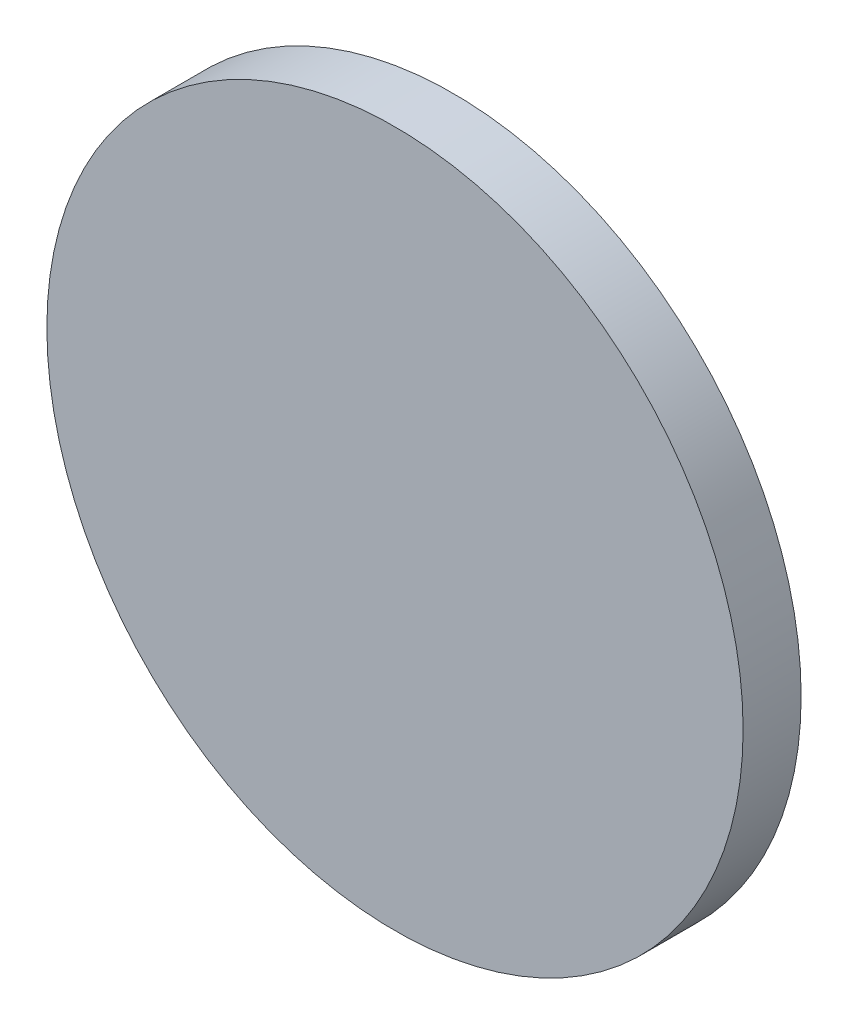
ISO-10303-21;
HEADER;
FILE_DESCRIPTION(('STEP AP214'),'2;1');
FILE_NAME('part.step','',(''),(''),'','','');
FILE_SCHEMA(('AUTOMOTIVE_DESIGN { 1 0 10303 214 1 1 1 1 }'));
ENDSEC;
DATA;
#1=APPLICATION_CONTEXT('core data for automotive mechanical design processes');
#2=APPLICATION_PROTOCOL_DEFINITION('international standard','automotive_design',2000,#1);
#3=PRODUCT_CONTEXT('',#1,'mechanical');
#4=PRODUCT('Part','Part','',(#3));
#5=PRODUCT_RELATED_PRODUCT_CATEGORY('part','',(#4));
#6=PRODUCT_DEFINITION_FORMATION('','',#4);
#7=PRODUCT_DEFINITION_CONTEXT('part definition',#1,'design');
#8=PRODUCT_DEFINITION('design','',#6,#7);
#9=PRODUCT_DEFINITION_SHAPE('','',#8);
#10=(LENGTH_UNIT() NAMED_UNIT(*) SI_UNIT(.MILLI.,.METRE.));
#11=(NAMED_UNIT(*) PLANE_ANGLE_UNIT() SI_UNIT($,.RADIAN.));
#12=(NAMED_UNIT(*) SI_UNIT($,.STERADIAN.) SOLID_ANGLE_UNIT());
#13=UNCERTAINTY_MEASURE_WITH_UNIT(LENGTH_MEASURE(1.E-05),#10,'distance_accuracy_value','');
#14=(GEOMETRIC_REPRESENTATION_CONTEXT(3) GLOBAL_UNCERTAINTY_ASSIGNED_CONTEXT((#13)) GLOBAL_UNIT_ASSIGNED_CONTEXT((#10,
#11,#12)) REPRESENTATION_CONTEXT('',''));
#15=CARTESIAN_POINT('',(0.,0.,0.));
#16=DIRECTION('',(0.,0.,1.));
#17=DIRECTION('',(1.,0.,0.));
#18=AXIS2_PLACEMENT_3D('',#15,#16,#17);
#19=CARTESIAN_POINT('',(0.,0.,10.));
#20=DIRECTION('',(0.,0.,-1.));
#21=DIRECTION('',(-1.,0.,0.));
#22=AXIS2_PLACEMENT_3D('',#19,#20,#21);
#23=CYLINDRICAL_SURFACE('',#22,60.);
#24=CARTESIAN_POINT('',(0.,0.,10.));
#25=DIRECTION('',(0.,0.,1.));
#26=DIRECTION('',(1.,0.,0.));
#27=AXIS2_PLACEMENT_3D('',#24,#25,#26);
#28=CIRCLE('',#27,60.);
#29=CARTESIAN_POINT('',(60.,0.,10.));
#30=VERTEX_POINT('',#29);
#31=EDGE_CURVE('E10',#30,#30,#28,.T.);
#32=ORIENTED_EDGE('',*,*,#31,.F.);
#33=EDGE_LOOP('',(#32));
#34=FACE_BOUND('',#33,.T.);
#35=CARTESIAN_POINT('',(0.,0.,0.));
#36=DIRECTION('',(0.,0.,1.));
#37=DIRECTION('',(1.,0.,0.));
#38=AXIS2_PLACEMENT_3D('',#35,#36,#37);
#39=CIRCLE('',#38,60.);
#40=CARTESIAN_POINT('',(60.,0.,0.));
#41=VERTEX_POINT('',#40);
#42=EDGE_CURVE('E36',#41,#41,#39,.T.);
#43=ORIENTED_EDGE('',*,*,#42,.T.);
#44=EDGE_LOOP('',(#43));
#45=FACE_BOUND('',#44,.T.);
#46=ADVANCED_FACE('F33',(#34,#45),#23,.T.);
#47=CARTESIAN_POINT('',(0.,0.,10.));
#48=DIRECTION('',(0.,0.,1.));
#49=DIRECTION('',(1.,0.,0.));
#50=AXIS2_PLACEMENT_3D('',#47,#48,#49);
#51=PLANE('',#50);
#52=ORIENTED_EDGE('',*,*,#31,.T.);
#53=EDGE_LOOP('',(#52));
#54=FACE_BOUND('',#53,.T.);
#55=ADVANCED_FACE('F48',(#54),#51,.T.);
#56=CARTESIAN_POINT('',(0.,0.,0.));
#57=DIRECTION('',(0.,0.,1.));
#58=DIRECTION('',(1.,0.,0.));
#59=AXIS2_PLACEMENT_3D('',#56,#57,#58);
#60=PLANE('',#59);
#61=ORIENTED_EDGE('',*,*,#42,.F.);
#62=EDGE_LOOP('',(#61));
#63=FACE_BOUND('',#62,.T.);
#64=ADVANCED_FACE('F46',(#63),#60,.F.);
#65=CLOSED_SHELL('',(#46,#55,#64));
#66=MANIFOLD_SOLID_BREP('B2',#65);
#67=ADVANCED_BREP_SHAPE_REPRESENTATION('',(#18,#66),#14);
#68=SHAPE_DEFINITION_REPRESENTATION(#9,#67);
ENDSEC;
END-ISO-10303-21;
